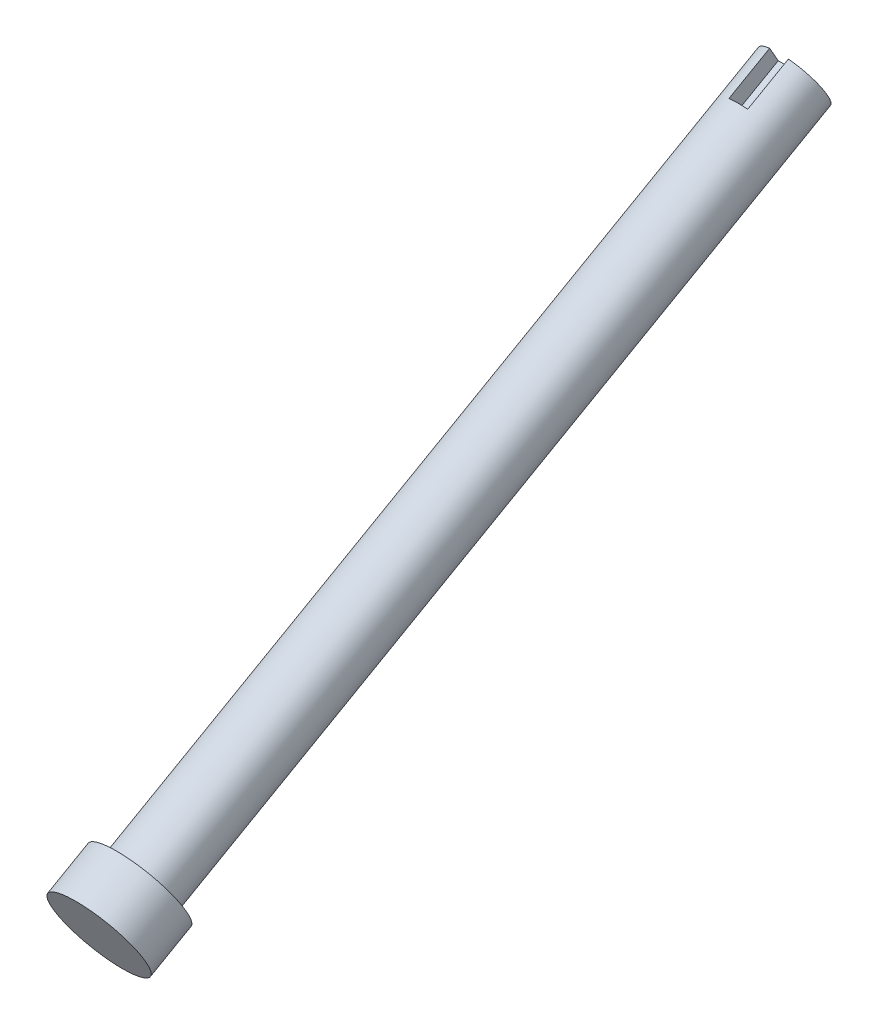
ISO-10303-21;
HEADER;
FILE_DESCRIPTION(('STEP AP214'),'2;1');
FILE_NAME('part.step','',(''),(''),'','','');
FILE_SCHEMA(('AUTOMOTIVE_DESIGN { 1 0 10303 214 1 1 1 1 }'));
ENDSEC;
DATA;
#1=APPLICATION_CONTEXT('core data for automotive mechanical design processes');
#2=APPLICATION_PROTOCOL_DEFINITION('international standard','automotive_design',2000,#1);
#3=PRODUCT_CONTEXT('',#1,'mechanical');
#4=PRODUCT('Part','Part','',(#3));
#5=PRODUCT_RELATED_PRODUCT_CATEGORY('part','',(#4));
#6=PRODUCT_DEFINITION_FORMATION('','',#4);
#7=PRODUCT_DEFINITION_CONTEXT('part definition',#1,'design');
#8=PRODUCT_DEFINITION('design','',#6,#7);
#9=PRODUCT_DEFINITION_SHAPE('','',#8);
#10=(LENGTH_UNIT() NAMED_UNIT(*) SI_UNIT(.MILLI.,.METRE.));
#11=(NAMED_UNIT(*) PLANE_ANGLE_UNIT() SI_UNIT($,.RADIAN.));
#12=(NAMED_UNIT(*) SI_UNIT($,.STERADIAN.) SOLID_ANGLE_UNIT());
#13=UNCERTAINTY_MEASURE_WITH_UNIT(LENGTH_MEASURE(1.E-05),#10,'distance_accuracy_value','');
#14=(GEOMETRIC_REPRESENTATION_CONTEXT(3) GLOBAL_UNCERTAINTY_ASSIGNED_CONTEXT((#13)) GLOBAL_UNIT_ASSIGNED_CONTEXT((#10,
#11,#12)) REPRESENTATION_CONTEXT('',''));
#15=CARTESIAN_POINT('',(0.,0.,0.));
#16=DIRECTION('',(0.,0.,1.));
#17=DIRECTION('',(1.,0.,0.));
#18=AXIS2_PLACEMENT_3D('',#15,#16,#17);
#19=CARTESIAN_POINT('',(27.75,70.3681781395573,-18.1563587618393));
#20=DIRECTION('',(0.,-0.494736971942381,0.869042765687215));
#21=DIRECTION('',(0.,-0.869042765687215,-0.494736971942381));
#22=AXIS2_PLACEMENT_3D('',#19,#20,#21);
#23=CYLINDRICAL_SURFACE('',#22,3.50000000000001);
#24=DIRECTION('',(0.,0.494736971942381,-0.869042765687215));
#25=VECTOR('',#24,1.);
#26=CARTESIAN_POINT('',(26.75,73.2830361887039,-16.4969605114709));
#27=LINE('',#26,#25);
#28=CARTESIAN_POINT('',(26.75,73.2830361887039,-16.4969605114709));
#29=VERTEX_POINT('',#28);
#30=CARTESIAN_POINT('',(26.75,75.7567210484158,-20.842174339907));
#31=VERTEX_POINT('',#30);
#32=EDGE_CURVE('E301',#29,#31,#27,.T.);
#33=ORIENTED_EDGE('',*,*,#32,.T.);
#34=CARTESIAN_POINT('',(27.75,72.8418629992692,-22.5015725902753));
#35=DIRECTION('',(0.,0.494736971942381,-0.869042765687215));
#36=DIRECTION('',(0.,0.869042765687215,0.494736971942381));
#37=AXIS2_PLACEMENT_3D('',#34,#35,#36);
#38=CIRCLE('',#37,3.49999999999999);
#39=CARTESIAN_POINT('',(26.75,69.9270049501226,-24.1609708406437));
#40=VERTEX_POINT('',#39);
#41=EDGE_CURVE('E164',#40,#31,#38,.T.);
#42=ORIENTED_EDGE('',*,*,#41,.F.);
#43=DIRECTION('',(0.,0.494736971942381,-0.869042765687215));
#44=VECTOR('',#43,1.);
#45=CARTESIAN_POINT('',(26.75,67.4533200904108,-19.8157570122076));
#46=LINE('',#45,#44);
#47=CARTESIAN_POINT('',(26.75,67.4533200904108,-19.8157570122076));
#48=VERTEX_POINT('',#47);
#49=EDGE_CURVE('E55',#48,#40,#46,.T.);
#50=ORIENTED_EDGE('',*,*,#49,.F.);
#51=CARTESIAN_POINT('',(27.75,70.3681781395573,-18.1563587618393));
#52=DIRECTION('',(0.,0.494736971942381,-0.869042765687215));
#53=DIRECTION('',(0.,0.869042765687215,0.494736971942381));
#54=AXIS2_PLACEMENT_3D('',#51,#52,#53);
#55=CIRCLE('',#54,3.49999999999993);
#56=CARTESIAN_POINT('',(28.75,67.4533200904108,-19.8157570122076));
#57=VERTEX_POINT('',#56);
#58=EDGE_CURVE('E146',#57,#48,#55,.T.);
#59=ORIENTED_EDGE('',*,*,#58,.F.);
#60=DIRECTION('',(0.,0.494736971942381,-0.869042765687215));
#61=VECTOR('',#60,1.);
#62=CARTESIAN_POINT('',(28.75,67.4533200904108,-19.8157570122076));
#63=LINE('',#62,#61);
#64=CARTESIAN_POINT('',(28.75,69.9270049501227,-24.1609708406437));
#65=VERTEX_POINT('',#64);
#66=EDGE_CURVE('E141',#57,#65,#63,.T.);
#67=ORIENTED_EDGE('',*,*,#66,.T.);
#68=CARTESIAN_POINT('',(28.75,75.7567210484157,-20.842174339907));
#69=VERTEX_POINT('',#68);
#70=EDGE_CURVE('E128',#69,#65,#38,.T.);
#71=ORIENTED_EDGE('',*,*,#70,.F.);
#72=DIRECTION('',(0.,0.494736971942381,-0.869042765687215));
#73=VECTOR('',#72,1.);
#74=CARTESIAN_POINT('',(28.75,73.2830361887039,-16.4969605114709));
#75=LINE('',#74,#73);
#76=CARTESIAN_POINT('',(28.75,73.2830361887039,-16.4969605114709));
#77=VERTEX_POINT('',#76);
#78=EDGE_CURVE('E63',#77,#69,#75,.T.);
#79=ORIENTED_EDGE('',*,*,#78,.F.);
#80=CARTESIAN_POINT('',(27.75,70.3681781395573,-18.1563587618393));
#81=DIRECTION('',(0.,0.494736971942381,-0.869042765687215));
#82=DIRECTION('',(0.,0.869042765687215,0.494736971942381));
#83=AXIS2_PLACEMENT_3D('',#80,#81,#82);
#84=CIRCLE('',#83,3.50000000000005);
#85=EDGE_CURVE('E113',#29,#77,#84,.T.);
#86=ORIENTED_EDGE('',*,*,#85,.F.);
#87=EDGE_LOOP('',(#33,#42,#50,#59,#67,#71,#79,#86));
#88=FACE_BOUND('',#87,.T.);
#89=CARTESIAN_POINT('',(27.75,33.0356414853082,47.4210545791358));
#90=DIRECTION('',(0.,-0.494736971942381,0.869042765687215));
#91=DIRECTION('',(0.,-0.869042765687215,-0.494736971942381));
#92=AXIS2_PLACEMENT_3D('',#89,#90,#91);
#93=CIRCLE('',#92,3.50000000000001);
#94=CARTESIAN_POINT('',(27.75,29.993991805403,45.6894751773374));
#95=VERTEX_POINT('',#94);
#96=EDGE_CURVE('E11',#95,#95,#93,.T.);
#97=ORIENTED_EDGE('',*,*,#96,.F.);
#98=EDGE_LOOP('',(#97));
#99=FACE_BOUND('',#98,.T.);
#100=ADVANCED_FACE('F41',(#88,#99),#23,.T.);
#101=CARTESIAN_POINT('',(27.75,30.5619566255963,51.7662684075718));
#102=DIRECTION('',(0.,0.494736971942381,-0.869042765687215));
#103=DIRECTION('',(0.,0.869042765687215,0.494736971942381));
#104=AXIS2_PLACEMENT_3D('',#101,#102,#103);
#105=CYLINDRICAL_SURFACE('',#104,5.);
#106=CARTESIAN_POINT('',(27.75,30.5619566255963,51.7662684075718));
#107=DIRECTION('',(0.,-0.494736971942381,0.869042765687215));
#108=DIRECTION('',(0.,-0.869042765687215,-0.494736971942381));
#109=AXIS2_PLACEMENT_3D('',#106,#107,#108);
#110=CIRCLE('',#109,5.);
#111=CARTESIAN_POINT('',(27.75,26.2167427971603,49.2925835478599));
#112=VERTEX_POINT('',#111);
#113=EDGE_CURVE('E48',#112,#112,#110,.T.);
#114=ORIENTED_EDGE('',*,*,#113,.F.);
#115=EDGE_LOOP('',(#114));
#116=FACE_BOUND('',#115,.T.);
#117=CARTESIAN_POINT('',(27.75,33.0356414853082,47.4210545791358));
#118=DIRECTION('',(0.,-0.494736971942381,0.869042765687215));
#119=DIRECTION('',(0.,-0.869042765687215,-0.494736971942381));
#120=AXIS2_PLACEMENT_3D('',#117,#118,#119);
#121=CIRCLE('',#120,5.);
#122=CARTESIAN_POINT('',(27.75,28.6904276568722,44.9473697194239));
#123=VERTEX_POINT('',#122);
#124=EDGE_CURVE('E163',#123,#123,#121,.T.);
#125=ORIENTED_EDGE('',*,*,#124,.T.);
#126=EDGE_LOOP('',(#125));
#127=FACE_BOUND('',#126,.T.);
#128=ADVANCED_FACE('F169',(#116,#127),#105,.T.);
#129=CARTESIAN_POINT('',(27.75,30.5619566255963,51.7662684075718));
#130=DIRECTION('',(0.,-0.494736971942381,0.869042765687215));
#131=DIRECTION('',(0.,-0.869042765687215,-0.494736971942381));
#132=AXIS2_PLACEMENT_3D('',#129,#130,#131);
#133=PLANE('',#132);
#134=ORIENTED_EDGE('',*,*,#113,.T.);
#135=EDGE_LOOP('',(#134));
#136=FACE_BOUND('',#135,.T.);
#137=ADVANCED_FACE('F174',(#136),#133,.T.);
#138=CARTESIAN_POINT('',(27.75,33.0356414853082,47.4210545791358));
#139=DIRECTION('',(0.,-0.494736971942381,0.869042765687215));
#140=DIRECTION('',(0.,-0.869042765687215,-0.494736971942381));
#141=AXIS2_PLACEMENT_3D('',#138,#139,#140);
#142=PLANE('',#141);
#143=ORIENTED_EDGE('',*,*,#96,.T.);
#144=EDGE_LOOP('',(#143));
#145=FACE_BOUND('',#144,.T.);
#146=ORIENTED_EDGE('',*,*,#124,.F.);
#147=EDGE_LOOP('',(#146));
#148=FACE_BOUND('',#147,.T.);
#149=ADVANCED_FACE('F171',(#145,#148),#142,.F.);
#150=CARTESIAN_POINT('',(27.75,72.8418629992692,-22.5015725902753));
#151=DIRECTION('',(0.,0.494736971942381,-0.869042765687215));
#152=DIRECTION('',(0.,0.869042765687215,0.494736971942381));
#153=AXIS2_PLACEMENT_3D('',#150,#151,#152);
#154=PLANE('',#153);
#155=DIRECTION('',(0.,0.869042765687215,0.494736971942381));
#156=VECTOR('',#155,1.);
#157=CARTESIAN_POINT('',(26.75,75.7567210484158,-20.842174339907));
#158=LINE('',#157,#156);
#159=CARTESIAN_POINT('',(26.75,74.1454271478,-21.7594671323617));
#160=VERTEX_POINT('',#159);
#161=EDGE_CURVE('E122',#160,#31,#158,.T.);
#162=ORIENTED_EDGE('',*,*,#161,.F.);
#163=DIRECTION('',(-1.,0.,0.));
#164=VECTOR('',#163,1.);
#165=CARTESIAN_POINT('',(28.75,74.1454271478,-21.7594671323617));
#166=LINE('',#165,#164);
#167=CARTESIAN_POINT('',(28.75,74.1454271478,-21.7594671323617));
#168=VERTEX_POINT('',#167);
#169=EDGE_CURVE('E293',#168,#160,#166,.T.);
#170=ORIENTED_EDGE('',*,*,#169,.F.);
#171=DIRECTION('',(0.,-0.869042765687215,-0.494736971942381));
#172=VECTOR('',#171,1.);
#173=CARTESIAN_POINT('',(28.75,75.7567210484158,-20.842174339907));
#174=LINE('',#173,#172);
#175=EDGE_CURVE('E151',#69,#168,#174,.T.);
#176=ORIENTED_EDGE('',*,*,#175,.F.);
#177=ORIENTED_EDGE('',*,*,#70,.T.);
#178=DIRECTION('',(0.,-0.869042765687216,-0.49473697194238));
#179=VECTOR('',#178,1.);
#180=CARTESIAN_POINT('',(28.75,69.9270049501227,-24.1609708406437));
#181=LINE('',#180,#179);
#182=CARTESIAN_POINT('',(28.75,71.5382988507384,-23.2436780481889));
#183=VERTEX_POINT('',#182);
#184=EDGE_CURVE('E143',#183,#65,#181,.T.);
#185=ORIENTED_EDGE('',*,*,#184,.F.);
#186=DIRECTION('',(1.,0.,0.));
#187=VECTOR('',#186,1.);
#188=CARTESIAN_POINT('',(28.75,71.5382988507384,-23.2436780481889));
#189=LINE('',#188,#187);
#190=CARTESIAN_POINT('',(26.75,71.5382988507384,-23.2436780481889));
#191=VERTEX_POINT('',#190);
#192=EDGE_CURVE('E145',#191,#183,#189,.T.);
#193=ORIENTED_EDGE('',*,*,#192,.F.);
#194=DIRECTION('',(0.,0.869042765687216,0.49473697194238));
#195=VECTOR('',#194,1.);
#196=CARTESIAN_POINT('',(26.75,69.9270049501227,-24.1609708406437));
#197=LINE('',#196,#195);
#198=EDGE_CURVE('E149',#40,#191,#197,.T.);
#199=ORIENTED_EDGE('',*,*,#198,.F.);
#200=ORIENTED_EDGE('',*,*,#41,.T.);
#201=EDGE_LOOP('',(#162,#170,#176,#177,#185,#193,#199,#200));
#202=FACE_BOUND('',#201,.T.);
#203=ADVANCED_FACE('F173',(#202),#154,.T.);
#204=CARTESIAN_POINT('',(28.75,67.4533200904108,-19.8157570122076));
#205=DIRECTION('',(1.,0.,0.));
#206=DIRECTION('',(0.,0.,-1.));
#207=AXIS2_PLACEMENT_3D('',#204,#205,#206);
#208=PLANE('',#207);
#209=ORIENTED_EDGE('',*,*,#184,.T.);
#210=ORIENTED_EDGE('',*,*,#66,.F.);
#211=DIRECTION('',(0.,-0.869042765687216,-0.49473697194238));
#212=VECTOR('',#211,1.);
#213=CARTESIAN_POINT('',(28.75,67.4533200904108,-19.8157570122076));
#214=LINE('',#213,#212);
#215=CARTESIAN_POINT('',(28.75,69.0646139910265,-18.8984642197528));
#216=VERTEX_POINT('',#215);
#217=EDGE_CURVE('E136',#216,#57,#214,.T.);
#218=ORIENTED_EDGE('',*,*,#217,.F.);
#219=DIRECTION('',(0.,0.494736971942381,-0.869042765687215));
#220=VECTOR('',#219,1.);
#221=CARTESIAN_POINT('',(28.75,69.0646139910265,-18.8984642197528));
#222=LINE('',#221,#220);
#223=EDGE_CURVE('E139',#216,#183,#222,.T.);
#224=ORIENTED_EDGE('',*,*,#223,.T.);
#225=EDGE_LOOP('',(#209,#210,#218,#224));
#226=FACE_BOUND('',#225,.T.);
#227=ADVANCED_FACE('F182',(#226),#208,.F.);
#228=CARTESIAN_POINT('',(28.75,69.0646139910265,-18.8984642197528));
#229=DIRECTION('',(0.,0.869042765687215,0.494736971942381));
#230=DIRECTION('',(0.,-0.494736971942381,0.869042765687215));
#231=AXIS2_PLACEMENT_3D('',#228,#229,#230);
#232=PLANE('',#231);
#233=ORIENTED_EDGE('',*,*,#192,.T.);
#234=ORIENTED_EDGE('',*,*,#223,.F.);
#235=DIRECTION('',(1.,0.,0.));
#236=VECTOR('',#235,1.);
#237=CARTESIAN_POINT('',(28.75,69.0646139910265,-18.8984642197528));
#238=LINE('',#237,#236);
#239=CARTESIAN_POINT('',(26.75,69.0646139910265,-18.8984642197528));
#240=VERTEX_POINT('',#239);
#241=EDGE_CURVE('E154',#240,#216,#238,.T.);
#242=ORIENTED_EDGE('',*,*,#241,.F.);
#243=DIRECTION('',(0.,0.494736971942381,-0.869042765687215));
#244=VECTOR('',#243,1.);
#245=CARTESIAN_POINT('',(26.75,69.0646139910265,-18.8984642197528));
#246=LINE('',#245,#244);
#247=EDGE_CURVE('E137',#240,#191,#246,.T.);
#248=ORIENTED_EDGE('',*,*,#247,.T.);
#249=EDGE_LOOP('',(#233,#234,#242,#248));
#250=FACE_BOUND('',#249,.T.);
#251=ADVANCED_FACE('F220',(#250),#232,.F.);
#252=CARTESIAN_POINT('',(26.75,67.4533200904108,-19.8157570122076));
#253=DIRECTION('',(-1.,0.,0.));
#254=DIRECTION('',(0.,-1.,0.));
#255=AXIS2_PLACEMENT_3D('',#252,#253,#254);
#256=PLANE('',#255);
#257=ORIENTED_EDGE('',*,*,#198,.T.);
#258=ORIENTED_EDGE('',*,*,#247,.F.);
#259=DIRECTION('',(0.,0.869042765687216,0.49473697194238));
#260=VECTOR('',#259,1.);
#261=CARTESIAN_POINT('',(26.75,67.4533200904108,-19.8157570122076));
#262=LINE('',#261,#260);
#263=EDGE_CURVE('E157',#48,#240,#262,.T.);
#264=ORIENTED_EDGE('',*,*,#263,.F.);
#265=ORIENTED_EDGE('',*,*,#49,.T.);
#266=EDGE_LOOP('',(#257,#258,#264,#265));
#267=FACE_BOUND('',#266,.T.);
#268=ADVANCED_FACE('F228',(#267),#256,.F.);
#269=CARTESIAN_POINT('',(27.75,70.3681781395573,-18.1563587618393));
#270=DIRECTION('',(0.,0.494736971942381,-0.869042765687215));
#271=DIRECTION('',(0.,0.869042765687215,0.494736971942381));
#272=AXIS2_PLACEMENT_3D('',#269,#270,#271);
#273=PLANE('',#272);
#274=ORIENTED_EDGE('',*,*,#58,.T.);
#275=ORIENTED_EDGE('',*,*,#263,.T.);
#276=ORIENTED_EDGE('',*,*,#241,.T.);
#277=ORIENTED_EDGE('',*,*,#217,.T.);
#278=EDGE_LOOP('',(#274,#275,#276,#277));
#279=FACE_BOUND('',#278,.T.);
#280=ADVANCED_FACE('F236',(#279),#273,.T.);
#281=CARTESIAN_POINT('',(26.75,73.2830361887039,-16.4969605114709));
#282=DIRECTION('',(-1.,0.,0.));
#283=DIRECTION('',(0.,0.,1.));
#284=AXIS2_PLACEMENT_3D('',#281,#282,#283);
#285=PLANE('',#284);
#286=ORIENTED_EDGE('',*,*,#161,.T.);
#287=ORIENTED_EDGE('',*,*,#32,.F.);
#288=DIRECTION('',(0.,0.869042765687215,0.494736971942381));
#289=VECTOR('',#288,1.);
#290=CARTESIAN_POINT('',(26.75,73.2830361887039,-16.4969605114709));
#291=LINE('',#290,#289);
#292=CARTESIAN_POINT('',(26.75,71.6717422880881,-17.4142533039257));
#293=VERTEX_POINT('',#292);
#294=EDGE_CURVE('E119',#293,#29,#291,.T.);
#295=ORIENTED_EDGE('',*,*,#294,.F.);
#296=DIRECTION('',(0.,0.494736971942381,-0.869042765687215));
#297=VECTOR('',#296,1.);
#298=CARTESIAN_POINT('',(26.75,71.6717422880881,-17.4142533039257));
#299=LINE('',#298,#297);
#300=EDGE_CURVE('E130',#293,#160,#299,.T.);
#301=ORIENTED_EDGE('',*,*,#300,.T.);
#302=EDGE_LOOP('',(#286,#287,#295,#301));
#303=FACE_BOUND('',#302,.T.);
#304=ADVANCED_FACE('F243',(#303),#285,.F.);
#305=CARTESIAN_POINT('',(28.75,71.6717422880881,-17.4142533039257));
#306=DIRECTION('',(0.,-0.869042765687215,-0.494736971942381));
#307=DIRECTION('',(0.,0.494736971942381,-0.869042765687215));
#308=AXIS2_PLACEMENT_3D('',#305,#306,#307);
#309=PLANE('',#308);
#310=ORIENTED_EDGE('',*,*,#169,.T.);
#311=ORIENTED_EDGE('',*,*,#300,.F.);
#312=DIRECTION('',(-1.,0.,0.));
#313=VECTOR('',#312,1.);
#314=CARTESIAN_POINT('',(28.75,71.6717422880881,-17.4142533039257));
#315=LINE('',#314,#313);
#316=CARTESIAN_POINT('',(28.75,71.6717422880881,-17.4142533039257));
#317=VERTEX_POINT('',#316);
#318=EDGE_CURVE('E112',#317,#293,#315,.T.);
#319=ORIENTED_EDGE('',*,*,#318,.F.);
#320=DIRECTION('',(0.,0.494736971942381,-0.869042765687215));
#321=VECTOR('',#320,1.);
#322=CARTESIAN_POINT('',(28.75,71.6717422880881,-17.4142533039257));
#323=LINE('',#322,#321);
#324=EDGE_CURVE('E108',#317,#168,#323,.T.);
#325=ORIENTED_EDGE('',*,*,#324,.T.);
#326=EDGE_LOOP('',(#310,#311,#319,#325));
#327=FACE_BOUND('',#326,.T.);
#328=ADVANCED_FACE('F251',(#327),#309,.F.);
#329=CARTESIAN_POINT('',(28.75,73.2830361887039,-16.4969605114709));
#330=DIRECTION('',(1.,0.,0.));
#331=DIRECTION('',(0.,0.,-1.));
#332=AXIS2_PLACEMENT_3D('',#329,#330,#331);
#333=PLANE('',#332);
#334=ORIENTED_EDGE('',*,*,#175,.T.);
#335=ORIENTED_EDGE('',*,*,#324,.F.);
#336=DIRECTION('',(0.,-0.869042765687215,-0.494736971942381));
#337=VECTOR('',#336,1.);
#338=CARTESIAN_POINT('',(28.75,73.2830361887039,-16.4969605114709));
#339=LINE('',#338,#337);
#340=EDGE_CURVE('E105',#77,#317,#339,.T.);
#341=ORIENTED_EDGE('',*,*,#340,.F.);
#342=ORIENTED_EDGE('',*,*,#78,.T.);
#343=EDGE_LOOP('',(#334,#335,#341,#342));
#344=FACE_BOUND('',#343,.T.);
#345=ADVANCED_FACE('F107',(#344),#333,.F.);
#346=CARTESIAN_POINT('',(27.75,70.3681781395573,-18.1563587618393));
#347=DIRECTION('',(0.,0.494736971942381,-0.869042765687215));
#348=DIRECTION('',(0.,0.869042765687215,0.494736971942381));
#349=AXIS2_PLACEMENT_3D('',#346,#347,#348);
#350=PLANE('',#349);
#351=ORIENTED_EDGE('',*,*,#85,.T.);
#352=ORIENTED_EDGE('',*,*,#340,.T.);
#353=ORIENTED_EDGE('',*,*,#318,.T.);
#354=ORIENTED_EDGE('',*,*,#294,.T.);
#355=EDGE_LOOP('',(#351,#352,#353,#354));
#356=FACE_BOUND('',#355,.T.);
#357=ADVANCED_FACE('F117',(#356),#350,.T.);
#358=CLOSED_SHELL('',(#100,#128,#137,#149,#203,#227,#251,#268,#280,#304,#328,#345,#357));
#359=MANIFOLD_SOLID_BREP('B2',#358);
#360=ADVANCED_BREP_SHAPE_REPRESENTATION('',(#18,#359),#14);
#361=SHAPE_DEFINITION_REPRESENTATION(#9,#360);
ENDSEC;
END-ISO-10303-21;
